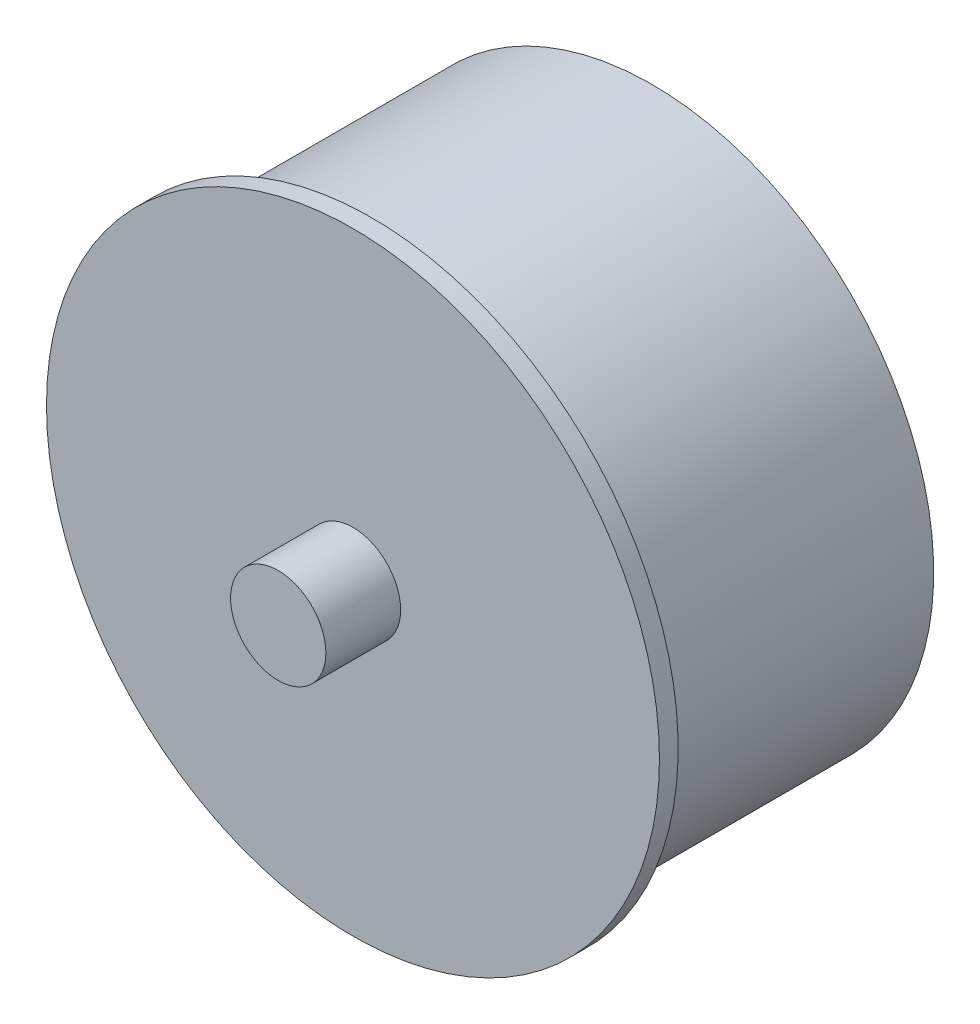
ISO-10303-21;
HEADER;
FILE_DESCRIPTION(('STEP AP214'),'2;1');
FILE_NAME('part.step','',(''),(''),'','','');
FILE_SCHEMA(('AUTOMOTIVE_DESIGN { 1 0 10303 214 1 1 1 1 }'));
ENDSEC;
DATA;
#1=APPLICATION_CONTEXT('core data for automotive mechanical design processes');
#2=APPLICATION_PROTOCOL_DEFINITION('international standard','automotive_design',2000,#1);
#3=PRODUCT_CONTEXT('',#1,'mechanical');
#4=PRODUCT('Part','Part','',(#3));
#5=PRODUCT_RELATED_PRODUCT_CATEGORY('part','',(#4));
#6=PRODUCT_DEFINITION_FORMATION('','',#4);
#7=PRODUCT_DEFINITION_CONTEXT('part definition',#1,'design');
#8=PRODUCT_DEFINITION('design','',#6,#7);
#9=PRODUCT_DEFINITION_SHAPE('','',#8);
#10=(LENGTH_UNIT() NAMED_UNIT(*) SI_UNIT(.MILLI.,.METRE.));
#11=(NAMED_UNIT(*) PLANE_ANGLE_UNIT() SI_UNIT($,.RADIAN.));
#12=(NAMED_UNIT(*) SI_UNIT($,.STERADIAN.) SOLID_ANGLE_UNIT());
#13=UNCERTAINTY_MEASURE_WITH_UNIT(LENGTH_MEASURE(1.E-05),#10,'distance_accuracy_value','');
#14=(GEOMETRIC_REPRESENTATION_CONTEXT(3) GLOBAL_UNCERTAINTY_ASSIGNED_CONTEXT((#13)) GLOBAL_UNIT_ASSIGNED_CONTEXT((#10,
#11,#12)) REPRESENTATION_CONTEXT('',''));
#15=CARTESIAN_POINT('',(0.,0.,0.));
#16=DIRECTION('',(0.,0.,1.));
#17=DIRECTION('',(1.,0.,0.));
#18=AXIS2_PLACEMENT_3D('',#15,#16,#17);
#19=CARTESIAN_POINT('',(0.,0.,-3.));
#20=DIRECTION('',(0.,0.,1.));
#21=DIRECTION('',(1.,0.,0.));
#22=AXIS2_PLACEMENT_3D('',#19,#20,#21);
#23=CYLINDRICAL_SURFACE('',#22,10.075);
#24=CARTESIAN_POINT('',(0.,0.,-3.));
#25=DIRECTION('',(0.,0.,-1.));
#26=DIRECTION('',(-1.,0.,0.));
#27=AXIS2_PLACEMENT_3D('',#24,#25,#26);
#28=CIRCLE('',#27,10.075);
#29=CARTESIAN_POINT('',(-10.075,0.,-3.));
#30=VERTEX_POINT('',#29);
#31=EDGE_CURVE('E11',#30,#30,#28,.T.);
#32=ORIENTED_EDGE('',*,*,#31,.F.);
#33=EDGE_LOOP('',(#32));
#34=FACE_BOUND('',#33,.T.);
#35=CARTESIAN_POINT('',(0.,0.,0.));
#36=DIRECTION('',(0.,0.,-1.));
#37=DIRECTION('',(-1.,0.,0.));
#38=AXIS2_PLACEMENT_3D('',#35,#36,#37);
#39=CIRCLE('',#38,10.075);
#40=CARTESIAN_POINT('',(-10.075,0.,0.));
#41=VERTEX_POINT('',#40);
#42=EDGE_CURVE('E52',#41,#41,#39,.T.);
#43=ORIENTED_EDGE('',*,*,#42,.T.);
#44=EDGE_LOOP('',(#43));
#45=FACE_BOUND('',#44,.T.);
#46=ADVANCED_FACE('F45',(#34,#45),#23,.T.);
#47=CARTESIAN_POINT('',(0.,0.,-3.));
#48=DIRECTION('',(0.,0.,-1.));
#49=DIRECTION('',(-1.,0.,0.));
#50=AXIS2_PLACEMENT_3D('',#47,#48,#49);
#51=PLANE('',#50);
#52=CARTESIAN_POINT('',(0.,8.,-3.));
#53=DIRECTION('',(0.,0.,-1.));
#54=DIRECTION('',(-1.,0.,0.));
#55=AXIS2_PLACEMENT_3D('',#52,#53,#54);
#56=CIRCLE('',#55,1.05);
#57=CARTESIAN_POINT('',(-1.05,8.,-3.));
#58=VERTEX_POINT('',#57);
#59=EDGE_CURVE('E66',#58,#58,#56,.T.);
#60=ORIENTED_EDGE('',*,*,#59,.F.);
#61=EDGE_LOOP('',(#60));
#62=FACE_BOUND('',#61,.T.);
#63=CARTESIAN_POINT('',(-8.,0.,-3.));
#64=DIRECTION('',(0.,0.,-1.));
#65=DIRECTION('',(-1.,0.,0.));
#66=AXIS2_PLACEMENT_3D('',#63,#64,#65);
#67=CIRCLE('',#66,1.05);
#68=CARTESIAN_POINT('',(-9.05,0.,-3.));
#69=VERTEX_POINT('',#68);
#70=EDGE_CURVE('E122',#69,#69,#67,.T.);
#71=ORIENTED_EDGE('',*,*,#70,.F.);
#72=EDGE_LOOP('',(#71));
#73=FACE_BOUND('',#72,.T.);
#74=CARTESIAN_POINT('',(0.,-8.,-3.));
#75=DIRECTION('',(0.,0.,-1.));
#76=DIRECTION('',(-1.,0.,0.));
#77=AXIS2_PLACEMENT_3D('',#74,#75,#76);
#78=CIRCLE('',#77,1.05);
#79=CARTESIAN_POINT('',(-1.04999999999994,-8.,-3.));
#80=VERTEX_POINT('',#79);
#81=EDGE_CURVE('E115',#80,#80,#78,.T.);
#82=ORIENTED_EDGE('',*,*,#81,.F.);
#83=EDGE_LOOP('',(#82));
#84=FACE_BOUND('',#83,.T.);
#85=CARTESIAN_POINT('',(8.,0.,-3.));
#86=DIRECTION('',(0.,0.,-1.));
#87=DIRECTION('',(-1.,0.,0.));
#88=AXIS2_PLACEMENT_3D('',#85,#86,#87);
#89=CIRCLE('',#88,1.05);
#90=CARTESIAN_POINT('',(6.95,0.,-3.));
#91=VERTEX_POINT('',#90);
#92=EDGE_CURVE('E59',#91,#91,#89,.T.);
#93=ORIENTED_EDGE('',*,*,#92,.F.);
#94=EDGE_LOOP('',(#93));
#95=FACE_BOUND('',#94,.T.);
#96=ORIENTED_EDGE('',*,*,#31,.T.);
#97=EDGE_LOOP('',(#96));
#98=FACE_BOUND('',#97,.T.);
#99=ADVANCED_FACE('F90',(#62,#73,#84,#95,#98),#51,.T.);
#100=CARTESIAN_POINT('',(0.,0.,0.));
#101=DIRECTION('',(0.,0.,-1.));
#102=DIRECTION('',(-1.,0.,0.));
#103=AXIS2_PLACEMENT_3D('',#100,#101,#102);
#104=PLANE('',#103);
#105=CARTESIAN_POINT('',(0.,8.,0.));
#106=DIRECTION('',(0.,0.,-1.));
#107=DIRECTION('',(-1.,0.,0.));
#108=AXIS2_PLACEMENT_3D('',#105,#106,#107);
#109=CIRCLE('',#108,1.05);
#110=CARTESIAN_POINT('',(-1.05,8.,0.));
#111=VERTEX_POINT('',#110);
#112=EDGE_CURVE('E48',#111,#111,#109,.T.);
#113=ORIENTED_EDGE('',*,*,#112,.T.);
#114=EDGE_LOOP('',(#113));
#115=FACE_BOUND('',#114,.T.);
#116=CARTESIAN_POINT('',(-8.,0.,0.));
#117=DIRECTION('',(0.,0.,-1.));
#118=DIRECTION('',(-1.,0.,0.));
#119=AXIS2_PLACEMENT_3D('',#116,#117,#118);
#120=CIRCLE('',#119,1.05);
#121=CARTESIAN_POINT('',(-9.05,0.,0.));
#122=VERTEX_POINT('',#121);
#123=EDGE_CURVE('E68',#122,#122,#120,.T.);
#124=ORIENTED_EDGE('',*,*,#123,.T.);
#125=EDGE_LOOP('',(#124));
#126=FACE_BOUND('',#125,.T.);
#127=CARTESIAN_POINT('',(0.,-8.,0.));
#128=DIRECTION('',(0.,0.,-1.));
#129=DIRECTION('',(-1.,0.,0.));
#130=AXIS2_PLACEMENT_3D('',#127,#128,#129);
#131=CIRCLE('',#130,1.05);
#132=CARTESIAN_POINT('',(-1.04999999999994,-8.,0.));
#133=VERTEX_POINT('',#132);
#134=EDGE_CURVE('E65',#133,#133,#131,.T.);
#135=ORIENTED_EDGE('',*,*,#134,.T.);
#136=EDGE_LOOP('',(#135));
#137=FACE_BOUND('',#136,.T.);
#138=CARTESIAN_POINT('',(8.,0.,0.));
#139=DIRECTION('',(0.,0.,-1.));
#140=DIRECTION('',(-1.,0.,0.));
#141=AXIS2_PLACEMENT_3D('',#138,#139,#140);
#142=CIRCLE('',#141,1.05);
#143=CARTESIAN_POINT('',(6.95,0.,0.));
#144=VERTEX_POINT('',#143);
#145=EDGE_CURVE('E62',#144,#144,#142,.T.);
#146=ORIENTED_EDGE('',*,*,#145,.T.);
#147=EDGE_LOOP('',(#146));
#148=FACE_BOUND('',#147,.T.);
#149=ORIENTED_EDGE('',*,*,#42,.F.);
#150=EDGE_LOOP('',(#149));
#151=FACE_BOUND('',#150,.T.);
#152=ADVANCED_FACE('F75',(#115,#126,#137,#148,#151),#104,.F.);
#153=CARTESIAN_POINT('',(8.,0.,7.));
#154=DIRECTION('',(0.,0.,-1.));
#155=DIRECTION('',(-1.,0.,0.));
#156=AXIS2_PLACEMENT_3D('',#153,#154,#155);
#157=CYLINDRICAL_SURFACE('',#156,1.05);
#158=ORIENTED_EDGE('',*,*,#92,.T.);
#159=EDGE_LOOP('',(#158));
#160=FACE_BOUND('',#159,.T.);
#161=ORIENTED_EDGE('',*,*,#145,.F.);
#162=EDGE_LOOP('',(#161));
#163=FACE_BOUND('',#162,.T.);
#164=ADVANCED_FACE('F101',(#160,#163),#157,.F.);
#165=CARTESIAN_POINT('',(0.,-8.,7.));
#166=DIRECTION('',(0.,0.,-1.));
#167=DIRECTION('',(-1.,0.,0.));
#168=AXIS2_PLACEMENT_3D('',#165,#166,#167);
#169=CYLINDRICAL_SURFACE('',#168,1.05);
#170=ORIENTED_EDGE('',*,*,#81,.T.);
#171=EDGE_LOOP('',(#170));
#172=FACE_BOUND('',#171,.T.);
#173=ORIENTED_EDGE('',*,*,#134,.F.);
#174=EDGE_LOOP('',(#173));
#175=FACE_BOUND('',#174,.T.);
#176=ADVANCED_FACE('F85',(#172,#175),#169,.F.);
#177=CARTESIAN_POINT('',(-8.,0.,7.));
#178=DIRECTION('',(0.,0.,-1.));
#179=DIRECTION('',(-1.,0.,0.));
#180=AXIS2_PLACEMENT_3D('',#177,#178,#179);
#181=CYLINDRICAL_SURFACE('',#180,1.05);
#182=ORIENTED_EDGE('',*,*,#70,.T.);
#183=EDGE_LOOP('',(#182));
#184=FACE_BOUND('',#183,.T.);
#185=ORIENTED_EDGE('',*,*,#123,.F.);
#186=EDGE_LOOP('',(#185));
#187=FACE_BOUND('',#186,.T.);
#188=ADVANCED_FACE('F79',(#184,#187),#181,.F.);
#189=CARTESIAN_POINT('',(0.,8.,7.));
#190=DIRECTION('',(0.,0.,-1.));
#191=DIRECTION('',(-1.,0.,0.));
#192=AXIS2_PLACEMENT_3D('',#189,#190,#191);
#193=CYLINDRICAL_SURFACE('',#192,1.05);
#194=ORIENTED_EDGE('',*,*,#59,.T.);
#195=EDGE_LOOP('',(#194));
#196=FACE_BOUND('',#195,.T.);
#197=ORIENTED_EDGE('',*,*,#112,.F.);
#198=EDGE_LOOP('',(#197));
#199=FACE_BOUND('',#198,.T.);
#200=ADVANCED_FACE('F77',(#196,#199),#193,.F.);
#201=CLOSED_SHELL('',(#46,#99,#152,#164,#176,#188,#200));
#202=MANIFOLD_SOLID_BREP('B2',#201);
#203=CARTESIAN_POINT('',(0.,0.,16.));
#204=DIRECTION('',(0.,0.,-1.));
#205=DIRECTION('',(-1.,0.,0.));
#206=AXIS2_PLACEMENT_3D('',#203,#204,#205);
#207=CYLINDRICAL_SURFACE('',#206,16.4);
#208=CARTESIAN_POINT('',(0.,0.,16.));
#209=DIRECTION('',(0.,0.,1.));
#210=DIRECTION('',(1.,0.,0.));
#211=AXIS2_PLACEMENT_3D('',#208,#209,#210);
#212=CIRCLE('',#211,16.4);
#213=CARTESIAN_POINT('',(16.4,0.,16.));
#214=VERTEX_POINT('',#213);
#215=EDGE_CURVE('E178',#214,#214,#212,.T.);
#216=ORIENTED_EDGE('',*,*,#215,.F.);
#217=EDGE_LOOP('',(#216));
#218=FACE_BOUND('',#217,.T.);
#219=CARTESIAN_POINT('',(0.,0.,15.));
#220=DIRECTION('',(0.,0.,-1.));
#221=DIRECTION('',(-1.,0.,0.));
#222=AXIS2_PLACEMENT_3D('',#219,#220,#221);
#223=CIRCLE('',#222,16.4);
#224=CARTESIAN_POINT('',(-16.4,0.,15.));
#225=VERTEX_POINT('',#224);
#226=EDGE_CURVE('E215',#225,#225,#223,.T.);
#227=ORIENTED_EDGE('',*,*,#226,.F.);
#228=EDGE_LOOP('',(#227));
#229=FACE_BOUND('',#228,.T.);
#230=ADVANCED_FACE('F170',(#218,#229),#207,.T.);
#231=CARTESIAN_POINT('',(0.,0.,16.));
#232=DIRECTION('',(0.,0.,1.));
#233=DIRECTION('',(1.,0.,0.));
#234=AXIS2_PLACEMENT_3D('',#231,#232,#233);
#235=PLANE('',#234);
#236=CARTESIAN_POINT('',(0.,0.,16.));
#237=DIRECTION('',(0.,0.,1.));
#238=DIRECTION('',(1.,0.,0.));
#239=AXIS2_PLACEMENT_3D('',#236,#237,#238);
#240=CIRCLE('',#239,2.55);
#241=CARTESIAN_POINT('',(2.55,0.,16.));
#242=VERTEX_POINT('',#241);
#243=EDGE_CURVE('E44',#242,#242,#240,.T.);
#244=ORIENTED_EDGE('',*,*,#243,.F.);
#245=EDGE_LOOP('',(#244));
#246=FACE_BOUND('',#245,.T.);
#247=ORIENTED_EDGE('',*,*,#215,.T.);
#248=EDGE_LOOP('',(#247));
#249=FACE_BOUND('',#248,.T.);
#250=ADVANCED_FACE('F230',(#246,#249),#235,.T.);
#251=CARTESIAN_POINT('',(0.,0.,20.));
#252=DIRECTION('',(0.,0.,-1.));
#253=DIRECTION('',(-1.,0.,0.));
#254=AXIS2_PLACEMENT_3D('',#251,#252,#253);
#255=CYLINDRICAL_SURFACE('',#254,2.55);
#256=CARTESIAN_POINT('',(0.,0.,20.));
#257=DIRECTION('',(0.,0.,1.));
#258=DIRECTION('',(1.,0.,0.));
#259=AXIS2_PLACEMENT_3D('',#256,#257,#258);
#260=CIRCLE('',#259,2.55);
#261=CARTESIAN_POINT('',(2.55,0.,20.));
#262=VERTEX_POINT('',#261);
#263=EDGE_CURVE('E184',#262,#262,#260,.T.);
#264=ORIENTED_EDGE('',*,*,#263,.F.);
#265=EDGE_LOOP('',(#264));
#266=FACE_BOUND('',#265,.T.);
#267=ORIENTED_EDGE('',*,*,#243,.T.);
#268=EDGE_LOOP('',(#267));
#269=FACE_BOUND('',#268,.T.);
#270=ADVANCED_FACE('F228',(#266,#269),#255,.T.);
#271=CARTESIAN_POINT('',(0.,0.,20.));
#272=DIRECTION('',(0.,0.,1.));
#273=DIRECTION('',(1.,0.,0.));
#274=AXIS2_PLACEMENT_3D('',#271,#272,#273);
#275=PLANE('',#274);
#276=ORIENTED_EDGE('',*,*,#263,.T.);
#277=EDGE_LOOP('',(#276));
#278=FACE_BOUND('',#277,.T.);
#279=ADVANCED_FACE('F226',(#278),#275,.T.);
#280=CARTESIAN_POINT('',(0.,0.,15.));
#281=DIRECTION('',(0.,0.,-1.));
#282=DIRECTION('',(-1.,0.,0.));
#283=AXIS2_PLACEMENT_3D('',#280,#281,#282);
#284=PLANE('',#283);
#285=CARTESIAN_POINT('',(0.,0.,15.));
#286=DIRECTION('',(0.,0.,-1.));
#287=DIRECTION('',(-1.,0.,0.));
#288=AXIS2_PLACEMENT_3D('',#285,#286,#287);
#289=CIRCLE('',#288,15.075);
#290=CARTESIAN_POINT('',(-15.075,0.,15.));
#291=VERTEX_POINT('',#290);
#292=EDGE_CURVE('E209',#291,#291,#289,.T.);
#293=ORIENTED_EDGE('',*,*,#292,.F.);
#294=EDGE_LOOP('',(#293));
#295=FACE_BOUND('',#294,.T.);
#296=ORIENTED_EDGE('',*,*,#226,.T.);
#297=EDGE_LOOP('',(#296));
#298=FACE_BOUND('',#297,.T.);
#299=ADVANCED_FACE('F236',(#295,#298),#284,.T.);
#300=CARTESIAN_POINT('',(0.,0.,15.));
#301=DIRECTION('',(0.,0.,-1.));
#302=DIRECTION('',(-1.,0.,0.));
#303=AXIS2_PLACEMENT_3D('',#300,#301,#302);
#304=CYLINDRICAL_SURFACE('',#303,15.075);
#305=ORIENTED_EDGE('',*,*,#292,.T.);
#306=EDGE_LOOP('',(#305));
#307=FACE_BOUND('',#306,.T.);
#308=CARTESIAN_POINT('',(0.,0.,0.));
#309=DIRECTION('',(0.,0.,-1.));
#310=DIRECTION('',(-1.,0.,0.));
#311=AXIS2_PLACEMENT_3D('',#308,#309,#310);
#312=CIRCLE('',#311,15.075);
#313=CARTESIAN_POINT('',(-15.075,0.,0.));
#314=VERTEX_POINT('',#313);
#315=EDGE_CURVE('E204',#314,#314,#312,.T.);
#316=ORIENTED_EDGE('',*,*,#315,.F.);
#317=EDGE_LOOP('',(#316));
#318=FACE_BOUND('',#317,.T.);
#319=ADVANCED_FACE('F270',(#307,#318),#304,.T.);
#320=CARTESIAN_POINT('',(0.,0.,0.));
#321=DIRECTION('',(0.,0.,1.));
#322=DIRECTION('',(1.,0.,0.));
#323=AXIS2_PLACEMENT_3D('',#320,#321,#322);
#324=PLANE('',#323);
#325=CARTESIAN_POINT('',(0.,8.,0.));
#326=DIRECTION('',(0.,0.,1.));
#327=DIRECTION('',(1.,0.,0.));
#328=AXIS2_PLACEMENT_3D('',#325,#326,#327);
#329=CIRCLE('',#328,1.05);
#330=CARTESIAN_POINT('',(1.05,8.,0.));
#331=VERTEX_POINT('',#330);
#332=EDGE_CURVE('E173',#331,#331,#329,.T.);
#333=ORIENTED_EDGE('',*,*,#332,.T.);
#334=EDGE_LOOP('',(#333));
#335=FACE_BOUND('',#334,.T.);
#336=CARTESIAN_POINT('',(-8.,0.,0.));
#337=DIRECTION('',(0.,0.,1.));
#338=DIRECTION('',(1.,0.,0.));
#339=AXIS2_PLACEMENT_3D('',#336,#337,#338);
#340=CIRCLE('',#339,1.05);
#341=CARTESIAN_POINT('',(-6.95,0.,0.));
#342=VERTEX_POINT('',#341);
#343=EDGE_CURVE('E197',#342,#342,#340,.T.);
#344=ORIENTED_EDGE('',*,*,#343,.T.);
#345=EDGE_LOOP('',(#344));
#346=FACE_BOUND('',#345,.T.);
#347=CARTESIAN_POINT('',(0.,-8.,0.));
#348=DIRECTION('',(0.,0.,1.));
#349=DIRECTION('',(1.,0.,0.));
#350=AXIS2_PLACEMENT_3D('',#347,#348,#349);
#351=CIRCLE('',#350,1.05);
#352=CARTESIAN_POINT('',(1.05000000000006,-8.,0.));
#353=VERTEX_POINT('',#352);
#354=EDGE_CURVE('E193',#353,#353,#351,.T.);
#355=ORIENTED_EDGE('',*,*,#354,.T.);
#356=EDGE_LOOP('',(#355));
#357=FACE_BOUND('',#356,.T.);
#358=CARTESIAN_POINT('',(8.,0.,0.));
#359=DIRECTION('',(0.,0.,1.));
#360=DIRECTION('',(1.,0.,0.));
#361=AXIS2_PLACEMENT_3D('',#358,#359,#360);
#362=CIRCLE('',#361,1.05);
#363=CARTESIAN_POINT('',(9.05,0.,0.));
#364=VERTEX_POINT('',#363);
#365=EDGE_CURVE('E189',#364,#364,#362,.T.);
#366=ORIENTED_EDGE('',*,*,#365,.T.);
#367=EDGE_LOOP('',(#366));
#368=FACE_BOUND('',#367,.T.);
#369=ORIENTED_EDGE('',*,*,#315,.T.);
#370=EDGE_LOOP('',(#369));
#371=FACE_BOUND('',#370,.T.);
#372=ADVANCED_FACE('F278',(#335,#346,#357,#368,#371),#324,.F.);
#373=CARTESIAN_POINT('',(8.,0.,7.));
#374=DIRECTION('',(0.,0.,-1.));
#375=DIRECTION('',(-1.,0.,0.));
#376=AXIS2_PLACEMENT_3D('',#373,#374,#375);
#377=CYLINDRICAL_SURFACE('',#376,1.05);
#378=CARTESIAN_POINT('',(8.,0.,7.));
#379=DIRECTION('',(0.,0.,-1.));
#380=DIRECTION('',(-1.,0.,0.));
#381=AXIS2_PLACEMENT_3D('',#378,#379,#380);
#382=CIRCLE('',#381,1.05);
#383=CARTESIAN_POINT('',(6.95,0.,7.));
#384=VERTEX_POINT('',#383);
#385=EDGE_CURVE('E386',#384,#384,#382,.T.);
#386=ORIENTED_EDGE('',*,*,#385,.F.);
#387=EDGE_LOOP('',(#386));
#388=FACE_BOUND('',#387,.T.);
#389=ORIENTED_EDGE('',*,*,#365,.F.);
#390=EDGE_LOOP('',(#389));
#391=FACE_BOUND('',#390,.T.);
#392=ADVANCED_FACE('F286',(#388,#391),#377,.F.);
#393=CARTESIAN_POINT('',(0.,0.,7.));
#394=DIRECTION('',(0.,0.,-1.));
#395=DIRECTION('',(-1.,0.,0.));
#396=AXIS2_PLACEMENT_3D('',#393,#394,#395);
#397=PLANE('',#396);
#398=ORIENTED_EDGE('',*,*,#385,.T.);
#399=EDGE_LOOP('',(#398));
#400=FACE_BOUND('',#399,.T.);
#401=ADVANCED_FACE('F291',(#400),#397,.T.);
#402=CARTESIAN_POINT('',(0.,-8.,7.));
#403=DIRECTION('',(0.,0.,-1.));
#404=DIRECTION('',(-1.,0.,0.));
#405=AXIS2_PLACEMENT_3D('',#402,#403,#404);
#406=CYLINDRICAL_SURFACE('',#405,1.05);
#407=CARTESIAN_POINT('',(0.,-8.,7.));
#408=DIRECTION('',(0.,0.,-1.));
#409=DIRECTION('',(-1.,0.,0.));
#410=AXIS2_PLACEMENT_3D('',#407,#408,#409);
#411=CIRCLE('',#410,1.05);
#412=CARTESIAN_POINT('',(-1.04999999999994,-8.,7.));
#413=VERTEX_POINT('',#412);
#414=EDGE_CURVE('E381',#413,#413,#411,.T.);
#415=ORIENTED_EDGE('',*,*,#414,.F.);
#416=EDGE_LOOP('',(#415));
#417=FACE_BOUND('',#416,.T.);
#418=ORIENTED_EDGE('',*,*,#354,.F.);
#419=EDGE_LOOP('',(#418));
#420=FACE_BOUND('',#419,.T.);
#421=ADVANCED_FACE('F299',(#417,#420),#406,.F.);
#422=CARTESIAN_POINT('',(0.,0.,7.));
#423=DIRECTION('',(0.,0.,-1.));
#424=DIRECTION('',(-1.,0.,0.));
#425=AXIS2_PLACEMENT_3D('',#422,#423,#424);
#426=PLANE('',#425);
#427=ORIENTED_EDGE('',*,*,#414,.T.);
#428=EDGE_LOOP('',(#427));
#429=FACE_BOUND('',#428,.T.);
#430=ADVANCED_FACE('F307',(#429),#426,.T.);
#431=CARTESIAN_POINT('',(-8.,0.,7.));
#432=DIRECTION('',(0.,0.,-1.));
#433=DIRECTION('',(-1.,0.,0.));
#434=AXIS2_PLACEMENT_3D('',#431,#432,#433);
#435=CYLINDRICAL_SURFACE('',#434,1.05);
#436=CARTESIAN_POINT('',(-8.,0.,7.));
#437=DIRECTION('',(0.,0.,-1.));
#438=DIRECTION('',(-1.,0.,0.));
#439=AXIS2_PLACEMENT_3D('',#436,#437,#438);
#440=CIRCLE('',#439,1.05);
#441=CARTESIAN_POINT('',(-9.05,0.,7.));
#442=VERTEX_POINT('',#441);
#443=EDGE_CURVE('E377',#442,#442,#440,.T.);
#444=ORIENTED_EDGE('',*,*,#443,.F.);
#445=EDGE_LOOP('',(#444));
#446=FACE_BOUND('',#445,.T.);
#447=ORIENTED_EDGE('',*,*,#343,.F.);
#448=EDGE_LOOP('',(#447));
#449=FACE_BOUND('',#448,.T.);
#450=ADVANCED_FACE('F315',(#446,#449),#435,.F.);
#451=CARTESIAN_POINT('',(0.,0.,7.));
#452=DIRECTION('',(0.,0.,-1.));
#453=DIRECTION('',(-1.,0.,0.));
#454=AXIS2_PLACEMENT_3D('',#451,#452,#453);
#455=PLANE('',#454);
#456=ORIENTED_EDGE('',*,*,#443,.T.);
#457=EDGE_LOOP('',(#456));
#458=FACE_BOUND('',#457,.T.);
#459=ADVANCED_FACE('F323',(#458),#455,.T.);
#460=CARTESIAN_POINT('',(0.,8.,7.));
#461=DIRECTION('',(0.,0.,-1.));
#462=DIRECTION('',(-1.,0.,0.));
#463=AXIS2_PLACEMENT_3D('',#460,#461,#462);
#464=CYLINDRICAL_SURFACE('',#463,1.05);
#465=CARTESIAN_POINT('',(0.,8.,7.));
#466=DIRECTION('',(0.,0.,-1.));
#467=DIRECTION('',(-1.,0.,0.));
#468=AXIS2_PLACEMENT_3D('',#465,#466,#467);
#469=CIRCLE('',#468,1.05);
#470=CARTESIAN_POINT('',(-1.05,8.,7.));
#471=VERTEX_POINT('',#470);
#472=EDGE_CURVE('E194',#471,#471,#469,.T.);
#473=ORIENTED_EDGE('',*,*,#472,.F.);
#474=EDGE_LOOP('',(#473));
#475=FACE_BOUND('',#474,.T.);
#476=ORIENTED_EDGE('',*,*,#332,.F.);
#477=EDGE_LOOP('',(#476));
#478=FACE_BOUND('',#477,.T.);
#479=ADVANCED_FACE('F331',(#475,#478),#464,.F.);
#480=CARTESIAN_POINT('',(0.,0.,7.));
#481=DIRECTION('',(0.,0.,-1.));
#482=DIRECTION('',(-1.,0.,0.));
#483=AXIS2_PLACEMENT_3D('',#480,#481,#482);
#484=PLANE('',#483);
#485=ORIENTED_EDGE('',*,*,#472,.T.);
#486=EDGE_LOOP('',(#485));
#487=FACE_BOUND('',#486,.T.);
#488=ADVANCED_FACE('F339',(#487),#484,.T.);
#489=CLOSED_SHELL('',(#230,#250,#270,#279,#299,#319,#372,#392,#401,#421,#430,#450,#459,#479,#488));
#490=MANIFOLD_SOLID_BREP('B6',#489);
#491=ADVANCED_BREP_SHAPE_REPRESENTATION('',(#18,#202,#490),#14);
#492=SHAPE_DEFINITION_REPRESENTATION(#9,#491);
ENDSEC;
END-ISO-10303-21;
